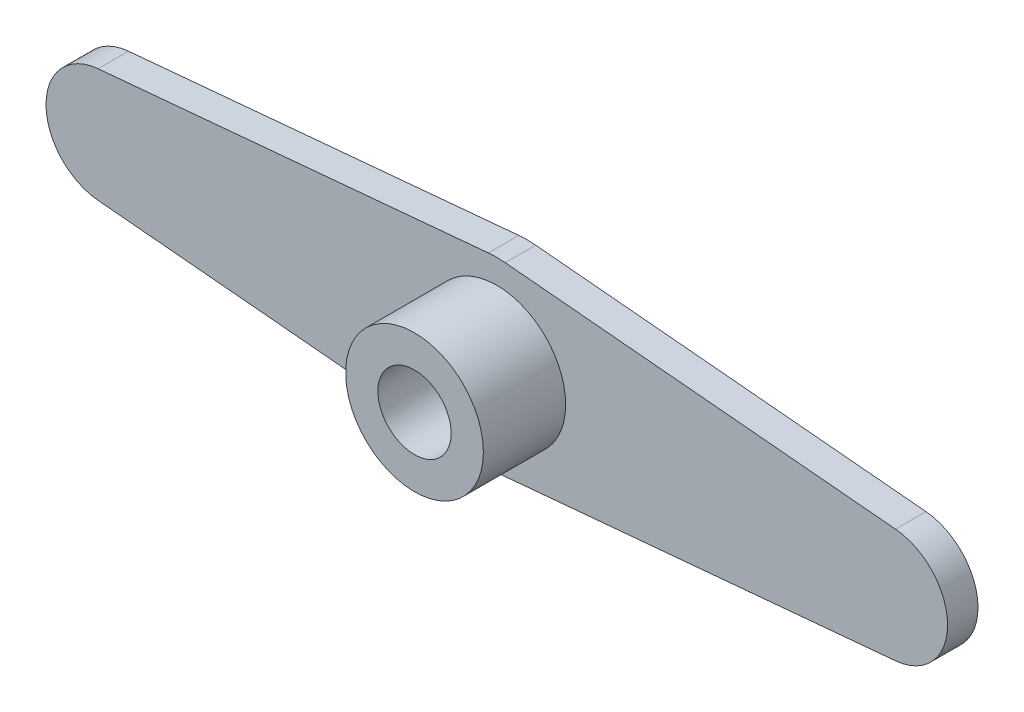
ISO-10303-21;
HEADER;
FILE_DESCRIPTION(('STEP AP214'),'2;1');
FILE_NAME('part.step','',(''),(''),'','','');
FILE_SCHEMA(('AUTOMOTIVE_DESIGN { 1 0 10303 214 1 1 1 1 }'));
ENDSEC;
DATA;
#1=APPLICATION_CONTEXT('core data for automotive mechanical design processes');
#2=APPLICATION_PROTOCOL_DEFINITION('international standard','automotive_design',2000,#1);
#3=PRODUCT_CONTEXT('',#1,'mechanical');
#4=PRODUCT('Part','Part','',(#3));
#5=PRODUCT_RELATED_PRODUCT_CATEGORY('part','',(#4));
#6=PRODUCT_DEFINITION_FORMATION('','',#4);
#7=PRODUCT_DEFINITION_CONTEXT('part definition',#1,'design');
#8=PRODUCT_DEFINITION('design','',#6,#7);
#9=PRODUCT_DEFINITION_SHAPE('','',#8);
#10=(LENGTH_UNIT() NAMED_UNIT(*) SI_UNIT(.MILLI.,.METRE.));
#11=(NAMED_UNIT(*) PLANE_ANGLE_UNIT() SI_UNIT($,.RADIAN.));
#12=(NAMED_UNIT(*) SI_UNIT($,.STERADIAN.) SOLID_ANGLE_UNIT());
#13=UNCERTAINTY_MEASURE_WITH_UNIT(LENGTH_MEASURE(1.E-05),#10,'distance_accuracy_value','');
#14=(GEOMETRIC_REPRESENTATION_CONTEXT(3) GLOBAL_UNCERTAINTY_ASSIGNED_CONTEXT((#13)) GLOBAL_UNIT_ASSIGNED_CONTEXT((#10,
#11,#12)) REPRESENTATION_CONTEXT('',''));
#15=CARTESIAN_POINT('',(0.,0.,0.));
#16=DIRECTION('',(0.,0.,1.));
#17=DIRECTION('',(1.,0.,0.));
#18=AXIS2_PLACEMENT_3D('',#15,#16,#17);
#19=CARTESIAN_POINT('',(-27.94,0.,2.159));
#20=DIRECTION('',(0.,0.,-1.));
#21=DIRECTION('',(-1.,0.,0.));
#22=AXIS2_PLACEMENT_3D('',#19,#20,#21);
#23=CYLINDRICAL_SURFACE('',#22,4.064);
#24=CARTESIAN_POINT('',(-27.94,0.,0.));
#25=DIRECTION('',(0.,0.,1.));
#26=DIRECTION('',(1.,0.,0.));
#27=AXIS2_PLACEMENT_3D('',#24,#25,#26);
#28=CIRCLE('',#27,4.064);
#29=CARTESIAN_POINT('',(-28.3094545454545,4.04717177036545,0.));
#30=VERTEX_POINT('',#29);
#31=CARTESIAN_POINT('',(-28.3094545454545,-4.04717177036545,0.));
#32=VERTEX_POINT('',#31);
#33=EDGE_CURVE('E149',#30,#32,#28,.T.);
#34=ORIENTED_EDGE('',*,*,#33,.T.);
#35=DIRECTION('',(0.,0.,-1.));
#36=VECTOR('',#35,1.);
#37=CARTESIAN_POINT('',(-28.3094545454545,-4.04717177036545,2.159));
#38=LINE('',#37,#36);
#39=CARTESIAN_POINT('',(-28.3094545454545,-4.04717177036545,2.159));
#40=VERTEX_POINT('',#39);
#41=EDGE_CURVE('E52',#40,#32,#38,.T.);
#42=ORIENTED_EDGE('',*,*,#41,.F.);
#43=CARTESIAN_POINT('',(-27.94,0.,2.159));
#44=DIRECTION('',(0.,0.,1.));
#45=DIRECTION('',(1.,0.,0.));
#46=AXIS2_PLACEMENT_3D('',#43,#44,#45);
#47=CIRCLE('',#46,4.064);
#48=CARTESIAN_POINT('',(-28.3094545454545,4.04717177036545,2.159));
#49=VERTEX_POINT('',#48);
#50=EDGE_CURVE('E177',#49,#40,#47,.T.);
#51=ORIENTED_EDGE('',*,*,#50,.F.);
#52=DIRECTION('',(0.,0.,-1.));
#53=VECTOR('',#52,1.);
#54=CARTESIAN_POINT('',(-28.3094545454545,4.04717177036545,2.159));
#55=LINE('',#54,#53);
#56=EDGE_CURVE('E60',#49,#30,#55,.T.);
#57=ORIENTED_EDGE('',*,*,#56,.T.);
#58=EDGE_LOOP('',(#34,#42,#51,#57));
#59=FACE_BOUND('',#58,.T.);
#60=ADVANCED_FACE('F43',(#59),#23,.T.);
#61=CARTESIAN_POINT('',(-28.3094545454545,-4.04717177036545,2.159));
#62=DIRECTION('',(0.0909090909090908,0.995859195463938,0.));
#63=DIRECTION('',(-0.995859195463939,0.0909090909090908,0.));
#64=AXIS2_PLACEMENT_3D('',#61,#62,#63);
#65=PLANE('',#64);
#66=DIRECTION('',(0.995859195463938,-0.0909090909090908,0.));
#67=VECTOR('',#66,1.);
#68=CARTESIAN_POINT('',(-28.3094545454545,-4.04717177036545,0.));
#69=LINE('',#68,#67);
#70=CARTESIAN_POINT('',(-0.60036363636364,-6.57665412684385,0.));
#71=VERTEX_POINT('',#70);
#72=EDGE_CURVE('E152',#32,#71,#69,.T.);
#73=ORIENTED_EDGE('',*,*,#72,.T.);
#74=DIRECTION('',(0.,0.,-1.));
#75=VECTOR('',#74,1.);
#76=CARTESIAN_POINT('',(-0.60036363636364,-6.57665412684385,2.159));
#77=LINE('',#76,#75);
#78=CARTESIAN_POINT('',(-0.60036363636364,-6.57665412684385,2.159));
#79=VERTEX_POINT('',#78);
#80=EDGE_CURVE('E190',#79,#71,#77,.T.);
#81=ORIENTED_EDGE('',*,*,#80,.F.);
#82=DIRECTION('',(0.995859195463938,-0.0909090909090908,0.));
#83=VECTOR('',#82,1.);
#84=CARTESIAN_POINT('',(-28.3094545454545,-4.04717177036545,2.159));
#85=LINE('',#84,#83);
#86=EDGE_CURVE('E100',#40,#79,#85,.T.);
#87=ORIENTED_EDGE('',*,*,#86,.F.);
#88=ORIENTED_EDGE('',*,*,#41,.T.);
#89=EDGE_LOOP('',(#73,#81,#87,#88));
#90=FACE_BOUND('',#89,.T.);
#91=ADVANCED_FACE('F195',(#90),#65,.F.);
#92=CARTESIAN_POINT('',(0.,0.,2.159));
#93=DIRECTION('',(0.,0.,-1.));
#94=DIRECTION('',(-1.,0.,0.));
#95=AXIS2_PLACEMENT_3D('',#92,#93,#94);
#96=CYLINDRICAL_SURFACE('',#95,6.604);
#97=CARTESIAN_POINT('',(0.,0.,0.));
#98=DIRECTION('',(0.,0.,1.));
#99=DIRECTION('',(1.,0.,0.));
#100=AXIS2_PLACEMENT_3D('',#97,#98,#99);
#101=CIRCLE('',#100,6.604);
#102=CARTESIAN_POINT('',(0.600363636363639,-6.57665412684385,0.));
#103=VERTEX_POINT('',#102);
#104=EDGE_CURVE('E156',#71,#103,#101,.T.);
#105=ORIENTED_EDGE('',*,*,#104,.T.);
#106=DIRECTION('',(0.,0.,-1.));
#107=VECTOR('',#106,1.);
#108=CARTESIAN_POINT('',(0.600363636363639,-6.57665412684385,2.159));
#109=LINE('',#108,#107);
#110=CARTESIAN_POINT('',(0.600363636363639,-6.57665412684385,2.159));
#111=VERTEX_POINT('',#110);
#112=EDGE_CURVE('E187',#111,#103,#109,.T.);
#113=ORIENTED_EDGE('',*,*,#112,.F.);
#114=CARTESIAN_POINT('',(0.,0.,2.159));
#115=DIRECTION('',(0.,0.,1.));
#116=DIRECTION('',(1.,0.,0.));
#117=AXIS2_PLACEMENT_3D('',#114,#115,#116);
#118=CIRCLE('',#117,6.604);
#119=EDGE_CURVE('E372',#79,#111,#118,.T.);
#120=ORIENTED_EDGE('',*,*,#119,.F.);
#121=ORIENTED_EDGE('',*,*,#80,.T.);
#122=EDGE_LOOP('',(#105,#113,#120,#121));
#123=FACE_BOUND('',#122,.T.);
#124=ADVANCED_FACE('F215',(#123),#96,.T.);
#125=CARTESIAN_POINT('',(28.3094545454545,-4.04717177036544,2.159));
#126=DIRECTION('',(0.0909090909090912,-0.995859195463938,0.));
#127=DIRECTION('',(0.995859195463939,0.0909090909090912,0.));
#128=AXIS2_PLACEMENT_3D('',#125,#126,#127);
#129=PLANE('',#128);
#130=DIRECTION('',(-0.995859195463938,-0.0909090909090912,0.));
#131=VECTOR('',#130,1.);
#132=CARTESIAN_POINT('',(28.3094545454545,-4.04717177036544,0.));
#133=LINE('',#132,#131);
#134=CARTESIAN_POINT('',(28.3094545454545,-4.04717177036544,0.));
#135=VERTEX_POINT('',#134);
#136=EDGE_CURVE('E160',#135,#103,#133,.T.);
#137=ORIENTED_EDGE('',*,*,#136,.F.);
#138=DIRECTION('',(0.,0.,-1.));
#139=VECTOR('',#138,1.);
#140=CARTESIAN_POINT('',(28.3094545454545,-4.04717177036544,2.159));
#141=LINE('',#140,#139);
#142=CARTESIAN_POINT('',(28.3094545454545,-4.04717177036544,2.159));
#143=VERTEX_POINT('',#142);
#144=EDGE_CURVE('E184',#143,#135,#141,.T.);
#145=ORIENTED_EDGE('',*,*,#144,.F.);
#146=DIRECTION('',(-0.995859195463938,-0.0909090909090912,0.));
#147=VECTOR('',#146,1.);
#148=CARTESIAN_POINT('',(28.3094545454545,-4.04717177036544,2.159));
#149=LINE('',#148,#147);
#150=EDGE_CURVE('E143',#143,#111,#149,.T.);
#151=ORIENTED_EDGE('',*,*,#150,.T.);
#152=ORIENTED_EDGE('',*,*,#112,.T.);
#153=EDGE_LOOP('',(#137,#145,#151,#152));
#154=FACE_BOUND('',#153,.T.);
#155=ADVANCED_FACE('F219',(#154),#129,.T.);
#156=CARTESIAN_POINT('',(27.94,0.,2.159));
#157=DIRECTION('',(0.,0.,-1.));
#158=DIRECTION('',(-1.,0.,0.));
#159=AXIS2_PLACEMENT_3D('',#156,#157,#158);
#160=CYLINDRICAL_SURFACE('',#159,4.064);
#161=CARTESIAN_POINT('',(27.94,0.,0.));
#162=DIRECTION('',(0.,0.,1.));
#163=DIRECTION('',(1.,0.,0.));
#164=AXIS2_PLACEMENT_3D('',#161,#162,#163);
#165=CIRCLE('',#164,4.064);
#166=CARTESIAN_POINT('',(28.3094545454545,4.04717177036546,0.));
#167=VERTEX_POINT('',#166);
#168=EDGE_CURVE('E164',#135,#167,#165,.T.);
#169=ORIENTED_EDGE('',*,*,#168,.T.);
#170=DIRECTION('',(0.,0.,-1.));
#171=VECTOR('',#170,1.);
#172=CARTESIAN_POINT('',(28.3094545454545,4.04717177036546,2.159));
#173=LINE('',#172,#171);
#174=CARTESIAN_POINT('',(28.3094545454545,4.04717177036546,2.159));
#175=VERTEX_POINT('',#174);
#176=EDGE_CURVE('E126',#175,#167,#173,.T.);
#177=ORIENTED_EDGE('',*,*,#176,.F.);
#178=CARTESIAN_POINT('',(27.94,0.,2.159));
#179=DIRECTION('',(0.,0.,1.));
#180=DIRECTION('',(1.,0.,0.));
#181=AXIS2_PLACEMENT_3D('',#178,#179,#180);
#182=CIRCLE('',#181,4.064);
#183=EDGE_CURVE('E138',#143,#175,#182,.T.);
#184=ORIENTED_EDGE('',*,*,#183,.F.);
#185=ORIENTED_EDGE('',*,*,#144,.T.);
#186=EDGE_LOOP('',(#169,#177,#184,#185));
#187=FACE_BOUND('',#186,.T.);
#188=ADVANCED_FACE('F225',(#187),#160,.T.);
#189=CARTESIAN_POINT('',(0.600363636363634,6.57665412684385,2.159));
#190=DIRECTION('',(0.0909090909090904,0.995859195463939,0.));
#191=DIRECTION('',(-0.995859195463939,0.0909090909090904,0.));
#192=AXIS2_PLACEMENT_3D('',#189,#190,#191);
#193=PLANE('',#192);
#194=DIRECTION('',(0.995859195463938,-0.0909090909090904,0.));
#195=VECTOR('',#194,1.);
#196=CARTESIAN_POINT('',(0.600363636363634,6.57665412684385,0.));
#197=LINE('',#196,#195);
#198=CARTESIAN_POINT('',(0.600363636363633,6.57665412684385,0.));
#199=VERTEX_POINT('',#198);
#200=EDGE_CURVE('E122',#199,#167,#197,.T.);
#201=ORIENTED_EDGE('',*,*,#200,.F.);
#202=DIRECTION('',(0.,0.,-1.));
#203=VECTOR('',#202,1.);
#204=CARTESIAN_POINT('',(0.600363636363633,6.57665412684385,2.159));
#205=LINE('',#204,#203);
#206=CARTESIAN_POINT('',(0.600363636363633,6.57665412684385,2.159));
#207=VERTEX_POINT('',#206);
#208=EDGE_CURVE('E116',#207,#199,#205,.T.);
#209=ORIENTED_EDGE('',*,*,#208,.F.);
#210=DIRECTION('',(0.995859195463938,-0.0909090909090904,0.));
#211=VECTOR('',#210,1.);
#212=CARTESIAN_POINT('',(0.600363636363634,6.57665412684385,2.159));
#213=LINE('',#212,#211);
#214=EDGE_CURVE('E120',#207,#175,#213,.T.);
#215=ORIENTED_EDGE('',*,*,#214,.T.);
#216=ORIENTED_EDGE('',*,*,#176,.T.);
#217=EDGE_LOOP('',(#201,#209,#215,#216));
#218=FACE_BOUND('',#217,.T.);
#219=ADVANCED_FACE('F118',(#218),#193,.T.);
#220=CARTESIAN_POINT('',(0.,0.,2.159));
#221=DIRECTION('',(0.,0.,-1.));
#222=DIRECTION('',(-1.,0.,0.));
#223=AXIS2_PLACEMENT_3D('',#220,#221,#222);
#224=CYLINDRICAL_SURFACE('',#223,6.604);
#225=CARTESIAN_POINT('',(0.,0.,0.));
#226=DIRECTION('',(0.,0.,1.));
#227=DIRECTION('',(1.,0.,0.));
#228=AXIS2_PLACEMENT_3D('',#225,#226,#227);
#229=CIRCLE('',#228,6.604);
#230=CARTESIAN_POINT('',(-0.600363636363636,6.57665412684385,0.));
#231=VERTEX_POINT('',#230);
#232=EDGE_CURVE('E170',#199,#231,#229,.T.);
#233=ORIENTED_EDGE('',*,*,#232,.T.);
#234=DIRECTION('',(0.,0.,-1.));
#235=VECTOR('',#234,1.);
#236=CARTESIAN_POINT('',(-0.600363636363636,6.57665412684385,2.159));
#237=LINE('',#236,#235);
#238=CARTESIAN_POINT('',(-0.600363636363636,6.57665412684385,2.159));
#239=VERTEX_POINT('',#238);
#240=EDGE_CURVE('E87',#239,#231,#237,.T.);
#241=ORIENTED_EDGE('',*,*,#240,.F.);
#242=CARTESIAN_POINT('',(0.,0.,2.159));
#243=DIRECTION('',(0.,0.,1.));
#244=DIRECTION('',(1.,0.,0.));
#245=AXIS2_PLACEMENT_3D('',#242,#243,#244);
#246=CIRCLE('',#245,6.604);
#247=EDGE_CURVE('E128',#207,#239,#246,.T.);
#248=ORIENTED_EDGE('',*,*,#247,.F.);
#249=ORIENTED_EDGE('',*,*,#208,.T.);
#250=EDGE_LOOP('',(#233,#241,#248,#249));
#251=FACE_BOUND('',#250,.T.);
#252=ADVANCED_FACE('F129',(#251),#224,.T.);
#253=CARTESIAN_POINT('',(-28.3094545454545,4.04717177036545,2.159));
#254=DIRECTION('',(-0.0909090909090907,0.995859195463938,0.));
#255=DIRECTION('',(-0.995859195463939,-0.0909090909090908,0.));
#256=AXIS2_PLACEMENT_3D('',#253,#254,#255);
#257=PLANE('',#256);
#258=DIRECTION('',(0.995859195463938,0.0909090909090908,0.));
#259=VECTOR('',#258,1.);
#260=CARTESIAN_POINT('',(-28.3094545454545,4.04717177036545,0.));
#261=LINE('',#260,#259);
#262=EDGE_CURVE('E173',#30,#231,#261,.T.);
#263=ORIENTED_EDGE('',*,*,#262,.F.);
#264=ORIENTED_EDGE('',*,*,#56,.F.);
#265=DIRECTION('',(0.995859195463938,0.0909090909090908,0.));
#266=VECTOR('',#265,1.);
#267=CARTESIAN_POINT('',(-28.3094545454545,4.04717177036545,2.159));
#268=LINE('',#267,#266);
#269=EDGE_CURVE('E133',#49,#239,#268,.T.);
#270=ORIENTED_EDGE('',*,*,#269,.T.);
#271=ORIENTED_EDGE('',*,*,#240,.T.);
#272=EDGE_LOOP('',(#263,#264,#270,#271));
#273=FACE_BOUND('',#272,.T.);
#274=ADVANCED_FACE('F199',(#273),#257,.T.);
#275=CARTESIAN_POINT('',(-27.94,0.,2.159));
#276=DIRECTION('',(0.,0.,1.));
#277=DIRECTION('',(1.,0.,0.));
#278=AXIS2_PLACEMENT_3D('',#275,#276,#277);
#279=PLANE('',#278);
#280=CARTESIAN_POINT('',(0.,0.,2.159));
#281=DIRECTION('',(0.,0.,1.));
#282=DIRECTION('',(1.,0.,0.));
#283=AXIS2_PLACEMENT_3D('',#280,#281,#282);
#284=CIRCLE('',#283,4.8895);
#285=CARTESIAN_POINT('',(4.8895,0.,2.159));
#286=VERTEX_POINT('',#285);
#287=EDGE_CURVE('E359',#286,#286,#284,.T.);
#288=ORIENTED_EDGE('',*,*,#287,.F.);
#289=EDGE_LOOP('',(#288));
#290=FACE_BOUND('',#289,.T.);
#291=ORIENTED_EDGE('',*,*,#50,.T.);
#292=ORIENTED_EDGE('',*,*,#86,.T.);
#293=ORIENTED_EDGE('',*,*,#119,.T.);
#294=ORIENTED_EDGE('',*,*,#150,.F.);
#295=ORIENTED_EDGE('',*,*,#183,.T.);
#296=ORIENTED_EDGE('',*,*,#214,.F.);
#297=ORIENTED_EDGE('',*,*,#247,.T.);
#298=ORIENTED_EDGE('',*,*,#269,.F.);
#299=EDGE_LOOP('',(#291,#292,#293,#294,#295,#296,#297,#298));
#300=FACE_BOUND('',#299,.T.);
#301=ADVANCED_FACE('F135',(#290,#300),#279,.T.);
#302=CARTESIAN_POINT('',(-27.94,0.,0.));
#303=DIRECTION('',(0.,0.,1.));
#304=DIRECTION('',(1.,0.,0.));
#305=AXIS2_PLACEMENT_3D('',#302,#303,#304);
#306=PLANE('',#305);
#307=ORIENTED_EDGE('',*,*,#33,.F.);
#308=ORIENTED_EDGE('',*,*,#262,.T.);
#309=ORIENTED_EDGE('',*,*,#232,.F.);
#310=ORIENTED_EDGE('',*,*,#200,.T.);
#311=ORIENTED_EDGE('',*,*,#168,.F.);
#312=ORIENTED_EDGE('',*,*,#136,.T.);
#313=ORIENTED_EDGE('',*,*,#104,.F.);
#314=ORIENTED_EDGE('',*,*,#72,.F.);
#315=EDGE_LOOP('',(#307,#308,#309,#310,#311,#312,#313,#314));
#316=FACE_BOUND('',#315,.T.);
#317=ADVANCED_FACE('F197',(#316),#306,.F.);
#318=CARTESIAN_POINT('',(0.,0.,8.001));
#319=DIRECTION('',(0.,0.,1.));
#320=DIRECTION('',(1.,0.,0.));
#321=AXIS2_PLACEMENT_3D('',#318,#319,#320);
#322=PLANE('',#321);
#323=CARTESIAN_POINT('',(0.,0.,8.001));
#324=DIRECTION('',(0.,0.,1.));
#325=DIRECTION('',(1.,0.,0.));
#326=AXIS2_PLACEMENT_3D('',#323,#324,#325);
#327=CIRCLE('',#326,4.8895);
#328=CARTESIAN_POINT('',(4.8895,0.,8.001));
#329=VERTEX_POINT('',#328);
#330=EDGE_CURVE('E153',#329,#329,#327,.T.);
#331=ORIENTED_EDGE('',*,*,#330,.T.);
#332=EDGE_LOOP('',(#331));
#333=FACE_BOUND('',#332,.T.);
#334=CARTESIAN_POINT('',(0.,0.,8.001));
#335=DIRECTION('',(0.,0.,1.));
#336=DIRECTION('',(1.,0.,0.));
#337=AXIS2_PLACEMENT_3D('',#334,#335,#336);
#338=CIRCLE('',#337,2.6035);
#339=CARTESIAN_POINT('',(2.6035,0.,8.001));
#340=VERTEX_POINT('',#339);
#341=EDGE_CURVE('E356',#340,#340,#338,.T.);
#342=ORIENTED_EDGE('',*,*,#341,.F.);
#343=EDGE_LOOP('',(#342));
#344=FACE_BOUND('',#343,.T.);
#345=ADVANCED_FACE('F255',(#333,#344),#322,.T.);
#346=CARTESIAN_POINT('',(0.,0.,8.001));
#347=DIRECTION('',(0.,0.,-1.));
#348=DIRECTION('',(-1.,0.,0.));
#349=AXIS2_PLACEMENT_3D('',#346,#347,#348);
#350=CYLINDRICAL_SURFACE('',#349,4.8895);
#351=ORIENTED_EDGE('',*,*,#330,.F.);
#352=EDGE_LOOP('',(#351));
#353=FACE_BOUND('',#352,.T.);
#354=ORIENTED_EDGE('',*,*,#287,.T.);
#355=EDGE_LOOP('',(#354));
#356=FACE_BOUND('',#355,.T.);
#357=ADVANCED_FACE('F271',(#353,#356),#350,.T.);
#358=CARTESIAN_POINT('',(0.,0.,8.001));
#359=DIRECTION('',(0.,0.,-1.));
#360=DIRECTION('',(-1.,0.,0.));
#361=AXIS2_PLACEMENT_3D('',#358,#359,#360);
#362=CYLINDRICAL_SURFACE('',#361,2.6035);
#363=ORIENTED_EDGE('',*,*,#341,.T.);
#364=EDGE_LOOP('',(#363));
#365=FACE_BOUND('',#364,.T.);
#366=CARTESIAN_POINT('',(0.,0.,2.159));
#367=DIRECTION('',(0.,0.,1.));
#368=DIRECTION('',(1.,0.,0.));
#369=AXIS2_PLACEMENT_3D('',#366,#367,#368);
#370=CIRCLE('',#369,2.6035);
#371=CARTESIAN_POINT('',(2.6035,0.,2.159));
#372=VERTEX_POINT('',#371);
#373=EDGE_CURVE('E11',#372,#372,#370,.F.);
#374=ORIENTED_EDGE('',*,*,#373,.T.);
#375=EDGE_LOOP('',(#374));
#376=FACE_BOUND('',#375,.T.);
#377=ADVANCED_FACE('F282',(#365,#376),#362,.F.);
#378=ORIENTED_EDGE('',*,*,#373,.F.);
#379=EDGE_LOOP('',(#378));
#380=FACE_BOUND('',#379,.T.);
#381=ADVANCED_FACE('F208',(#380),#279,.T.);
#382=CLOSED_SHELL('',(#60,#91,#124,#155,#188,#219,#252,#274,#301,#317,#345,#357,#377,#381));
#383=MANIFOLD_SOLID_BREP('B2',#382);
#384=ADVANCED_BREP_SHAPE_REPRESENTATION('',(#18,#383),#14);
#385=SHAPE_DEFINITION_REPRESENTATION(#9,#384);
ENDSEC;
END-ISO-10303-21;
